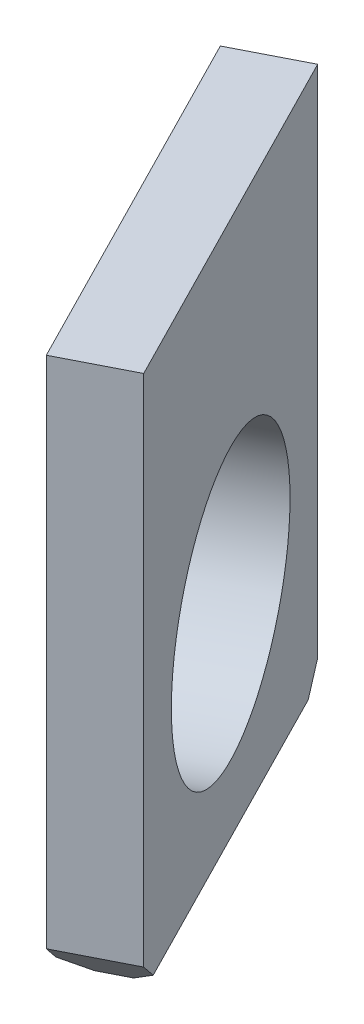
ISO-10303-21;
HEADER;
FILE_DESCRIPTION(('STEP AP214'),'2;1');
FILE_NAME('part.step','',(''),(''),'','','');
FILE_SCHEMA(('AUTOMOTIVE_DESIGN { 1 0 10303 214 1 1 1 1 }'));
ENDSEC;
DATA;
#1=APPLICATION_CONTEXT('core data for automotive mechanical design processes');
#2=APPLICATION_PROTOCOL_DEFINITION('international standard','automotive_design',2000,#1);
#3=PRODUCT_CONTEXT('',#1,'mechanical');
#4=PRODUCT('Part','Part','',(#3));
#5=PRODUCT_RELATED_PRODUCT_CATEGORY('part','',(#4));
#6=PRODUCT_DEFINITION_FORMATION('','',#4);
#7=PRODUCT_DEFINITION_CONTEXT('part definition',#1,'design');
#8=PRODUCT_DEFINITION('design','',#6,#7);
#9=PRODUCT_DEFINITION_SHAPE('','',#8);
#10=(LENGTH_UNIT() NAMED_UNIT(*) SI_UNIT(.MILLI.,.METRE.));
#11=(NAMED_UNIT(*) PLANE_ANGLE_UNIT() SI_UNIT($,.RADIAN.));
#12=(NAMED_UNIT(*) SI_UNIT($,.STERADIAN.) SOLID_ANGLE_UNIT());
#13=UNCERTAINTY_MEASURE_WITH_UNIT(LENGTH_MEASURE(1.E-05),#10,'distance_accuracy_value','');
#14=(GEOMETRIC_REPRESENTATION_CONTEXT(3) GLOBAL_UNCERTAINTY_ASSIGNED_CONTEXT((#13)) GLOBAL_UNIT_ASSIGNED_CONTEXT((#10,
#11,#12)) REPRESENTATION_CONTEXT('',''));
#15=CARTESIAN_POINT('',(0.,0.,0.));
#16=DIRECTION('',(0.,0.,1.));
#17=DIRECTION('',(1.,0.,0.));
#18=AXIS2_PLACEMENT_3D('',#15,#16,#17);
#19=CARTESIAN_POINT('',(12.921180081,-5.55,1.828685184));
#20=DIRECTION('',(-0.630036755334839,-0.70710678118682,0.321019760959918));
#21=DIRECTION('',(0.746623710453192,-0.665246597127042,0.));
#22=AXIS2_PLACEMENT_3D('',#19,#20,#21);
#23=PLANE('',#22);
#24=DIRECTION('',(0.776534393823974,-0.57735026920262,0.252311319326136));
#25=VECTOR('',#24,1.);
#26=CARTESIAN_POINT('',(11.4911100067995,-5.54999999998334,-0.97798536719836));
#27=LINE('',#26,#25);
#28=CARTESIAN_POINT('',(11.4911100067856,-5.54999999999172,-0.977985367195817));
#29=VERTEX_POINT('',#28);
#30=CARTESIAN_POINT('',(11.6928595604004,-5.70000000000157,-0.912432963535005));
#31=VERTEX_POINT('',#30);
#32=EDGE_CURVE('E79',#29,#31,#27,.T.);
#33=ORIENTED_EDGE('',*,*,#32,.T.);
#34=DIRECTION('',(-0.453990499725944,0.,-0.891006524195299));
#35=VECTOR('',#34,1.);
#36=CARTESIAN_POINT('',(12.6689391348048,-5.7,1.00323106347704));
#37=LINE('',#36,#35);
#38=CARTESIAN_POINT('',(12.6689391348088,-5.699999999992,1.00323106347578));
#39=VERTEX_POINT('',#38);
#40=EDGE_CURVE('E87',#39,#31,#37,.T.);
#41=ORIENTED_EDGE('',*,*,#40,.F.);
#42=DIRECTION('',(-0.252311319403715,0.577350269215938,0.776534393788865));
#43=VECTOR('',#42,1.);
#44=CARTESIAN_POINT('',(12.6689391348196,-5.69999999997732,1.0032310634695));
#45=LINE('',#44,#43);
#46=CARTESIAN_POINT('',(12.6033867311302,-5.54999999998266,1.20498061705847));
#47=VERTEX_POINT('',#46);
#48=EDGE_CURVE('E95',#39,#47,#45,.T.);
#49=ORIENTED_EDGE('',*,*,#48,.T.);
#50=DIRECTION('',(-0.453990499740055,0.,-0.891006524188109));
#51=VECTOR('',#50,1.);
#52=CARTESIAN_POINT('',(11.4230114318,-5.54999999999203,-1.11163634582));
#53=LINE('',#52,#51);
#54=EDGE_CURVE('E104',#47,#29,#53,.T.);
#55=ORIENTED_EDGE('',*,*,#54,.T.);
#56=EDGE_LOOP('',(#33,#41,#49,#55));
#57=FACE_BOUND('',#56,.T.);
#58=ADVANCED_FACE('F18',(#57),#23,.T.);
#59=CARTESIAN_POINT('',(12.27,-5.7,0.));
#60=DIRECTION('',(0.,-1.,0.));
#61=DIRECTION('',(0.,0.,-1.));
#62=AXIS2_PLACEMENT_3D('',#59,#60,#61);
#63=PLANE('',#62);
#64=DIRECTION('',(0.891006524148934,0.,-0.45399049981694));
#65=VECTOR('',#64,1.);
#66=CARTESIAN_POINT('',(11.6928595603995,-5.7,-0.912432963531999));
#67=LINE('',#66,#65);
#68=CARTESIAN_POINT('',(11.8710608651906,-5.69999999999413,-1.00323106347676));
#69=VERTEX_POINT('',#68);
#70=EDGE_CURVE('E102',#31,#69,#67,.T.);
#71=ORIENTED_EDGE('',*,*,#70,.T.);
#72=DIRECTION('',(-0.453990499730981,9.51637025000242E-12,-0.891006524192733));
#73=VECTOR('',#72,1.);
#74=CARTESIAN_POINT('',(12.8471404395966,-5.69999999999821,0.912432963535247));
#75=LINE('',#74,#73);
#76=CARTESIAN_POINT('',(12.8471404396004,-5.70000000000145,0.912432963534592));
#77=VERTEX_POINT('',#76);
#78=EDGE_CURVE('E90',#77,#69,#75,.T.);
#79=ORIENTED_EDGE('',*,*,#78,.F.);
#80=DIRECTION('',(-0.891006524153518,0.,0.453990499807944));
#81=VECTOR('',#80,1.);
#82=CARTESIAN_POINT('',(12.847140439601,-5.7,0.912432963533032));
#83=LINE('',#82,#81);
#84=EDGE_CURVE('E84',#77,#39,#83,.T.);
#85=ORIENTED_EDGE('',*,*,#84,.T.);
#86=ORIENTED_EDGE('',*,*,#40,.T.);
#87=EDGE_LOOP('',(#71,#79,#85,#86));
#88=FACE_BOUND('',#87,.T.);
#89=ADVANCED_FACE('F86',(#88),#63,.T.);
#90=CARTESIAN_POINT('',(11.4230114318,-2.35,-1.11163634582));
#91=DIRECTION('',(0.891006524188109,0.,-0.453990499740055));
#92=DIRECTION('',(-0.453990499740055,0.,-0.891006524188109));
#93=AXIS2_PLACEMENT_3D('',#90,#91,#92);
#94=PLANE('',#93);
#95=CARTESIAN_POINT('',(12.0472483689855,-4.15,0.113497624918464));
#96=DIRECTION('',(0.891006524188109,0.,-0.453990499740055));
#97=DIRECTION('',(-0.453990499740055,0.,-0.891006524188109));
#98=AXIS2_PLACEMENT_3D('',#95,#96,#97);
#99=CIRCLE('',#98,0.9375);
#100=CARTESIAN_POINT('',(11.6216322754792,-4.15,-0.721820991507888));
#101=VERTEX_POINT('',#100);
#102=EDGE_CURVE('E21',#101,#101,#99,.T.);
#103=ORIENTED_EDGE('',*,*,#102,.T.);
#104=EDGE_LOOP('',(#103));
#105=FACE_BOUND('',#104,.T.);
#106=DIRECTION('',(0.,1.,0.));
#107=VECTOR('',#106,1.);
#108=CARTESIAN_POINT('',(12.6714853060926,-2.35,1.33863159569375));
#109=LINE('',#108,#107);
#110=CARTESIAN_POINT('',(12.6714853060908,-5.39999999999994,1.33863159569474));
#111=VERTEX_POINT('',#110);
#112=CARTESIAN_POINT('',(12.6714853060917,-1.85,1.33863159569422));
#113=VERTEX_POINT('',#112);
#114=EDGE_CURVE('E115',#111,#113,#109,.T.);
#115=ORIENTED_EDGE('',*,*,#114,.T.);
#116=DIRECTION('',(-0.453990499744076,0.,-0.89100652418606));
#117=VECTOR('',#116,1.);
#118=CARTESIAN_POINT('',(12.6714853060963,-1.85,1.33863159569188));
#119=LINE('',#118,#117);
#120=CARTESIAN_POINT('',(11.4230114318005,-1.85,-1.11163634581907));
#121=VERTEX_POINT('',#120);
#122=EDGE_CURVE('E120',#113,#121,#119,.T.);
#123=ORIENTED_EDGE('',*,*,#122,.T.);
#124=DIRECTION('',(0.,1.,0.));
#125=VECTOR('',#124,1.);
#126=CARTESIAN_POINT('',(11.4230114318012,-2.35,-1.11163634581757));
#127=LINE('',#126,#125);
#128=CARTESIAN_POINT('',(11.4230114318001,-5.40000000000112,-1.1116363458198));
#129=VERTEX_POINT('',#128);
#130=EDGE_CURVE('E125',#121,#129,#127,.F.);
#131=ORIENTED_EDGE('',*,*,#130,.T.);
#132=DIRECTION('',(-0.321019761046659,0.707106781186274,-0.630036755291254));
#133=VECTOR('',#132,1.);
#134=CARTESIAN_POINT('',(11.4911100067809,-5.55000000000819,-0.977985367197886));
#135=LINE('',#134,#133);
#136=EDGE_CURVE('E128',#29,#129,#135,.T.);
#137=ORIENTED_EDGE('',*,*,#136,.F.);
#138=ORIENTED_EDGE('',*,*,#54,.F.);
#139=DIRECTION('',(-0.321019761002382,-0.707106781186278,-0.63003675531381));
#140=VECTOR('',#139,1.);
#141=CARTESIAN_POINT('',(12.6714853060927,-5.40000000000011,1.33863159569386));
#142=LINE('',#141,#140);
#143=EDGE_CURVE('E99',#111,#47,#142,.T.);
#144=ORIENTED_EDGE('',*,*,#143,.F.);
#145=EDGE_LOOP('',(#115,#123,#131,#137,#138,#144));
#146=FACE_BOUND('',#145,.T.);
#147=ADVANCED_FACE('F168',(#105,#146),#94,.F.);
#148=CARTESIAN_POINT('',(11.618819919,-5.55,-1.828685184));
#149=DIRECTION('',(0.630036755334839,-0.70710678118682,-0.321019760959918));
#150=DIRECTION('',(0.746623710453192,0.665246597127042,0.));
#151=AXIS2_PLACEMENT_3D('',#148,#149,#150);
#152=PLANE('',#151);
#153=DIRECTION('',(0.776534393849392,0.577350269170361,0.252311319321723));
#154=VECTOR('',#153,1.);
#155=CARTESIAN_POINT('',(12.847140439603,-5.7000000000076,0.912432963537056));
#156=LINE('',#155,#154);
#157=CARTESIAN_POINT('',(13.0488899932097,-5.54999999999406,0.977985367197057));
#158=VERTEX_POINT('',#157);
#159=EDGE_CURVE('E111',#77,#158,#156,.T.);
#160=ORIENTED_EDGE('',*,*,#159,.F.);
#161=ORIENTED_EDGE('',*,*,#78,.T.);
#162=DIRECTION('',(-0.252311319428912,-0.577350269156654,0.776534393824755));
#163=VECTOR('',#162,1.);
#164=CARTESIAN_POINT('',(11.9366132688808,-5.55000000000404,-1.20498061707517));
#165=LINE('',#164,#163);
#166=CARTESIAN_POINT('',(11.9366132688701,-5.54999999998367,-1.20498061706216));
#167=VERTEX_POINT('',#166);
#168=EDGE_CURVE('E131',#167,#69,#165,.T.);
#169=ORIENTED_EDGE('',*,*,#168,.F.);
#170=DIRECTION('',(0.453990499740055,0.,0.891006524188109));
#171=VECTOR('',#170,1.);
#172=CARTESIAN_POINT('',(13.1169885682,-5.54999999999506,1.11163634582));
#173=LINE('',#172,#171);
#174=EDGE_CURVE('E134',#167,#158,#173,.T.);
#175=ORIENTED_EDGE('',*,*,#174,.T.);
#176=EDGE_LOOP('',(#160,#161,#169,#175));
#177=FACE_BOUND('',#176,.T.);
#178=ADVANCED_FACE('F166',(#177),#152,.T.);
#179=CARTESIAN_POINT('',(13.5647417154,-5.4,0.883494722228));
#180=DIRECTION('',(0.321019760959918,-0.70710678118682,0.630036755334839));
#181=DIRECTION('',(0.,-0.665246597127042,-0.746623710453192));
#182=AXIS2_PLACEMENT_3D('',#179,#180,#181);
#183=PLANE('',#182);
#184=DIRECTION('',(0.321019760969577,0.707106781166476,0.630036755352751));
#185=VECTOR('',#184,1.);
#186=CARTESIAN_POINT('',(13.048889993234,-5.55000000000075,0.977985367181956));
#187=LINE('',#186,#185);
#188=CARTESIAN_POINT('',(13.1169885681992,-5.39999999999936,1.11163634581849));
#189=VERTEX_POINT('',#188);
#190=EDGE_CURVE('E137',#158,#189,#187,.T.);
#191=ORIENTED_EDGE('',*,*,#190,.T.);
#192=DIRECTION('',(-0.891006524188109,0.,0.453990499740055));
#193=VECTOR('',#192,1.);
#194=CARTESIAN_POINT('',(12.6714853061,-5.39999999999946,1.33863159569));
#195=LINE('',#194,#193);
#196=EDGE_CURVE('E113',#189,#111,#195,.T.);
#197=ORIENTED_EDGE('',*,*,#196,.T.);
#198=ORIENTED_EDGE('',*,*,#143,.T.);
#199=ORIENTED_EDGE('',*,*,#48,.F.);
#200=ORIENTED_EDGE('',*,*,#84,.F.);
#201=ORIENTED_EDGE('',*,*,#159,.T.);
#202=EDGE_LOOP('',(#191,#197,#198,#199,#200,#201));
#203=FACE_BOUND('',#202,.T.);
#204=ADVANCED_FACE('F97',(#203),#183,.T.);
#205=CARTESIAN_POINT('',(12.6714853061,-2.35,1.33863159569));
#206=DIRECTION('',(-0.453990499740055,0.,-0.891006524188109));
#207=DIRECTION('',(-0.891006524188109,0.,0.453990499740055));
#208=AXIS2_PLACEMENT_3D('',#205,#206,#207);
#209=PLANE('',#208);
#210=DIRECTION('',(-0.891006524189346,0.,0.453990499737628));
#211=VECTOR('',#210,1.);
#212=CARTESIAN_POINT('',(13.1169885681994,-1.85,1.11163634581879));
#213=LINE('',#212,#211);
#214=CARTESIAN_POINT('',(13.1169885681991,-1.85,1.11163634581821));
#215=VERTEX_POINT('',#214);
#216=EDGE_CURVE('E117',#215,#113,#213,.T.);
#217=ORIENTED_EDGE('',*,*,#216,.T.);
#218=ORIENTED_EDGE('',*,*,#114,.F.);
#219=ORIENTED_EDGE('',*,*,#196,.F.);
#220=DIRECTION('',(0.,1.,0.));
#221=VECTOR('',#220,1.);
#222=CARTESIAN_POINT('',(13.1169885681994,-2.35,1.11163634581891));
#223=LINE('',#222,#221);
#224=EDGE_CURVE('E139',#189,#215,#223,.T.);
#225=ORIENTED_EDGE('',*,*,#224,.T.);
#226=EDGE_LOOP('',(#217,#218,#219,#225));
#227=FACE_BOUND('',#226,.T.);
#228=ADVANCED_FACE('F163',(#227),#209,.F.);
#229=CARTESIAN_POINT('',(12.27,-1.85,0.));
#230=DIRECTION('',(0.,-1.,0.));
#231=DIRECTION('',(0.,0.,-1.));
#232=AXIS2_PLACEMENT_3D('',#229,#230,#231);
#233=PLANE('',#232);
#234=ORIENTED_EDGE('',*,*,#216,.F.);
#235=DIRECTION('',(0.453990499740055,0.,0.891006524188109));
#236=VECTOR('',#235,1.);
#237=CARTESIAN_POINT('',(13.1169885682,-1.85,1.11163634582));
#238=LINE('',#237,#236);
#239=CARTESIAN_POINT('',(11.8685146939064,-1.85,-1.33863159569329));
#240=VERTEX_POINT('',#239);
#241=EDGE_CURVE('E142',#215,#240,#238,.F.);
#242=ORIENTED_EDGE('',*,*,#241,.T.);
#243=DIRECTION('',(0.891006524188109,0.,-0.453990499740055));
#244=VECTOR('',#243,1.);
#245=CARTESIAN_POINT('',(11.8685146939,-1.85,-1.33863159569));
#246=LINE('',#245,#244);
#247=EDGE_CURVE('E122',#240,#121,#246,.F.);
#248=ORIENTED_EDGE('',*,*,#247,.T.);
#249=ORIENTED_EDGE('',*,*,#122,.F.);
#250=EDGE_LOOP('',(#234,#242,#248,#249));
#251=FACE_BOUND('',#250,.T.);
#252=ADVANCED_FACE('F160',(#251),#233,.F.);
#253=CARTESIAN_POINT('',(11.8685146939,-2.35,-1.33863159569));
#254=DIRECTION('',(0.453990499740055,0.,0.891006524188109));
#255=DIRECTION('',(0.891006524188109,0.,-0.453990499740055));
#256=AXIS2_PLACEMENT_3D('',#253,#254,#255);
#257=PLANE('',#256);
#258=ORIENTED_EDGE('',*,*,#247,.F.);
#259=DIRECTION('',(0.,1.,0.));
#260=VECTOR('',#259,1.);
#261=CARTESIAN_POINT('',(11.8685146939147,-2.35,-1.33863159569751));
#262=LINE('',#261,#260);
#263=CARTESIAN_POINT('',(11.868514693906,-5.40000000000163,-1.33863159569408));
#264=VERTEX_POINT('',#263);
#265=EDGE_CURVE('E145',#240,#264,#262,.F.);
#266=ORIENTED_EDGE('',*,*,#265,.T.);
#267=DIRECTION('',(0.891006524189189,-1.71043734728089E-12,-0.453990499737935));
#268=VECTOR('',#267,1.);
#269=CARTESIAN_POINT('',(11.4230114317991,-5.4000000000027,-1.1116363458218));
#270=LINE('',#269,#268);
#271=EDGE_CURVE('E35',#129,#264,#270,.T.);
#272=ORIENTED_EDGE('',*,*,#271,.F.);
#273=ORIENTED_EDGE('',*,*,#130,.F.);
#274=EDGE_LOOP('',(#258,#266,#272,#273));
#275=FACE_BOUND('',#274,.T.);
#276=ADVANCED_FACE('F156',(#275),#257,.F.);
#277=CARTESIAN_POINT('',(10.9480188546,-5.4,-0.869615539421));
#278=DIRECTION('',(-0.321019760959918,-0.70710678118682,-0.630036755334839));
#279=DIRECTION('',(0.,0.665246597127042,-0.746623710453192));
#280=AXIS2_PLACEMENT_3D('',#277,#278,#279);
#281=PLANE('',#280);
#282=DIRECTION('',(0.321019760974107,-0.707106781156489,0.63003675536165));
#283=VECTOR('',#282,1.);
#284=CARTESIAN_POINT('',(11.8685146939143,-5.40000000000089,-1.3386315956983));
#285=LINE('',#284,#283);
#286=EDGE_CURVE('E27',#264,#167,#285,.T.);
#287=ORIENTED_EDGE('',*,*,#286,.T.);
#288=ORIENTED_EDGE('',*,*,#168,.T.);
#289=ORIENTED_EDGE('',*,*,#70,.F.);
#290=ORIENTED_EDGE('',*,*,#32,.F.);
#291=ORIENTED_EDGE('',*,*,#136,.T.);
#292=ORIENTED_EDGE('',*,*,#271,.T.);
#293=EDGE_LOOP('',(#287,#288,#289,#290,#291,#292));
#294=FACE_BOUND('',#293,.T.);
#295=ADVANCED_FACE('F148',(#294),#281,.T.);
#296=CARTESIAN_POINT('',(12.27,-4.15,0.));
#297=DIRECTION('',(0.891006524188109,0.,-0.453990499740055));
#298=DIRECTION('',(-0.453990499740055,0.,-0.891006524188109));
#299=AXIS2_PLACEMENT_3D('',#296,#297,#298);
#300=CYLINDRICAL_SURFACE('',#299,0.9375);
#301=ORIENTED_EDGE('',*,*,#102,.F.);
#302=EDGE_LOOP('',(#301));
#303=FACE_BOUND('',#302,.T.);
#304=CARTESIAN_POINT('',(12.4927516310838,-4.15,-0.113497624953756));
#305=DIRECTION('',(0.891006524188109,0.,-0.453990499740055));
#306=DIRECTION('',(-0.453990499740055,0.,-0.891006524188109));
#307=AXIS2_PLACEMENT_3D('',#304,#305,#306);
#308=CIRCLE('',#307,0.9375);
#309=CARTESIAN_POINT('',(12.0671355375775,-4.15,-0.948816241380108));
#310=VERTEX_POINT('',#309);
#311=EDGE_CURVE('E11',#310,#310,#308,.T.);
#312=ORIENTED_EDGE('',*,*,#311,.T.);
#313=EDGE_LOOP('',(#312));
#314=FACE_BOUND('',#313,.T.);
#315=ADVANCED_FACE('F179',(#303,#314),#300,.F.);
#316=CARTESIAN_POINT('',(13.1169885682,-2.35,1.11163634582));
#317=DIRECTION('',(-0.891006524188109,0.,0.453990499740055));
#318=DIRECTION('',(0.453990499740055,0.,0.891006524188109));
#319=AXIS2_PLACEMENT_3D('',#316,#317,#318);
#320=PLANE('',#319);
#321=ORIENTED_EDGE('',*,*,#311,.F.);
#322=EDGE_LOOP('',(#321));
#323=FACE_BOUND('',#322,.T.);
#324=ORIENTED_EDGE('',*,*,#265,.F.);
#325=ORIENTED_EDGE('',*,*,#241,.F.);
#326=ORIENTED_EDGE('',*,*,#224,.F.);
#327=ORIENTED_EDGE('',*,*,#190,.F.);
#328=ORIENTED_EDGE('',*,*,#174,.F.);
#329=ORIENTED_EDGE('',*,*,#286,.F.);
#330=EDGE_LOOP('',(#324,#325,#326,#327,#328,#329));
#331=FACE_BOUND('',#330,.T.);
#332=ADVANCED_FACE('F152',(#323,#331),#320,.F.);
#333=CLOSED_SHELL('',(#58,#89,#147,#178,#204,#228,#252,#276,#295,#315,#332));
#334=MANIFOLD_SOLID_BREP('B1',#333);
#335=ADVANCED_BREP_SHAPE_REPRESENTATION('',(#18,#334),#14);
#336=SHAPE_DEFINITION_REPRESENTATION(#9,#335);
ENDSEC;
END-ISO-10303-21;
